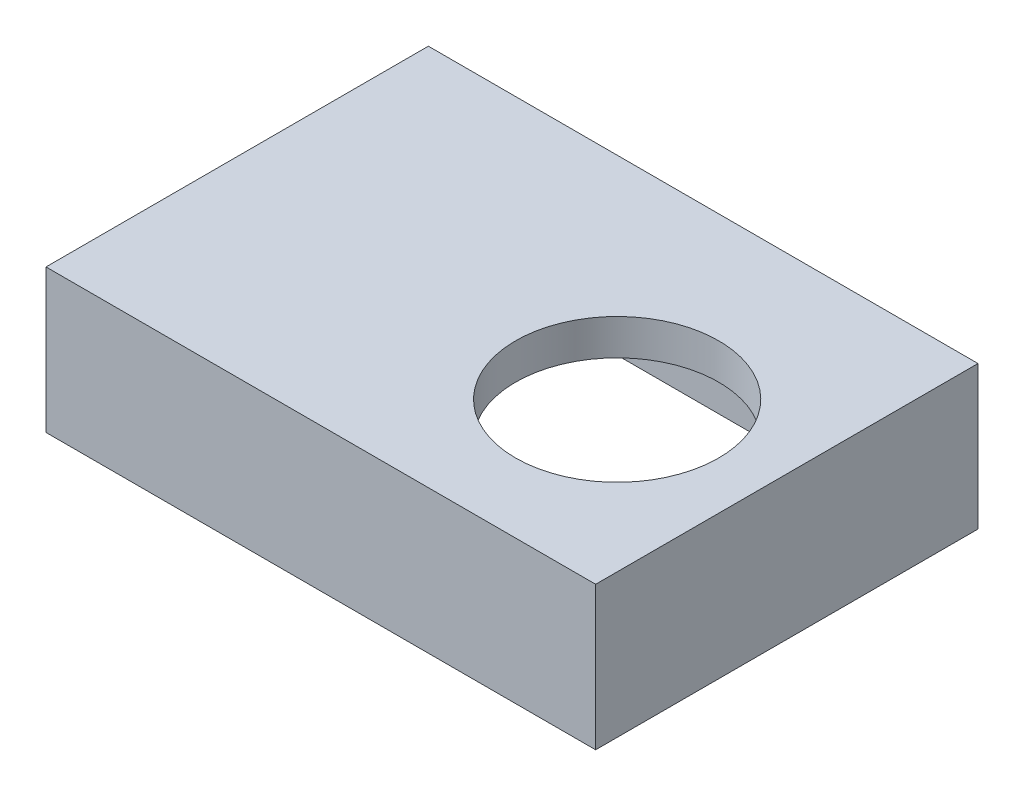
ISO-10303-21;
HEADER;
FILE_DESCRIPTION(('STEP AP214'),'2;1');
FILE_NAME('part.step','',(''),(''),'','','');
FILE_SCHEMA(('AUTOMOTIVE_DESIGN { 1 0 10303 214 1 1 1 1 }'));
ENDSEC;
DATA;
#1=APPLICATION_CONTEXT('core data for automotive mechanical design processes');
#2=APPLICATION_PROTOCOL_DEFINITION('international standard','automotive_design',2000,#1);
#3=PRODUCT_CONTEXT('',#1,'mechanical');
#4=PRODUCT('Part','Part','',(#3));
#5=PRODUCT_RELATED_PRODUCT_CATEGORY('part','',(#4));
#6=PRODUCT_DEFINITION_FORMATION('','',#4);
#7=PRODUCT_DEFINITION_CONTEXT('part definition',#1,'design');
#8=PRODUCT_DEFINITION('design','',#6,#7);
#9=PRODUCT_DEFINITION_SHAPE('','',#8);
#10=(LENGTH_UNIT() NAMED_UNIT(*) SI_UNIT(.MILLI.,.METRE.));
#11=(NAMED_UNIT(*) PLANE_ANGLE_UNIT() SI_UNIT($,.RADIAN.));
#12=(NAMED_UNIT(*) SI_UNIT($,.STERADIAN.) SOLID_ANGLE_UNIT());
#13=UNCERTAINTY_MEASURE_WITH_UNIT(LENGTH_MEASURE(1.E-05),#10,'distance_accuracy_value','');
#14=(GEOMETRIC_REPRESENTATION_CONTEXT(3) GLOBAL_UNCERTAINTY_ASSIGNED_CONTEXT((#13)) GLOBAL_UNIT_ASSIGNED_CONTEXT((#10,
#11,#12)) REPRESENTATION_CONTEXT('',''));
#15=CARTESIAN_POINT('',(0.,0.,0.));
#16=DIRECTION('',(0.,0.,1.));
#17=DIRECTION('',(1.,0.,0.));
#18=AXIS2_PLACEMENT_3D('',#15,#16,#17);
#19=CARTESIAN_POINT('',(0.,0.,0.));
#20=DIRECTION('',(0.,-1.,0.));
#21=DIRECTION('',(0.,0.,-1.));
#22=AXIS2_PLACEMENT_3D('',#19,#20,#21);
#23=PLANE('',#22);
#24=CARTESIAN_POINT('',(10.5,0.,1.7));
#25=DIRECTION('',(0.,1.,0.));
#26=DIRECTION('',(0.,0.,1.));
#27=AXIS2_PLACEMENT_3D('',#24,#25,#26);
#28=CIRCLE('',#27,8.5);
#29=CARTESIAN_POINT('',(10.5,0.,10.2));
#30=VERTEX_POINT('',#29);
#31=EDGE_CURVE('E270',#30,#30,#28,.T.);
#32=ORIENTED_EDGE('',*,*,#31,.T.);
#33=EDGE_LOOP('',(#32));
#34=FACE_BOUND('',#33,.T.);
#35=DIRECTION('',(-1.,0.,0.));
#36=VECTOR('',#35,1.);
#37=CARTESIAN_POINT('',(0.,0.,-13.5));
#38=LINE('',#37,#36);
#39=CARTESIAN_POINT('',(16.5,0.,-13.5));
#40=VERTEX_POINT('',#39);
#41=CARTESIAN_POINT('',(-20.5,0.,-13.5));
#42=VERTEX_POINT('',#41);
#43=EDGE_CURVE('E212',#40,#42,#38,.T.);
#44=ORIENTED_EDGE('',*,*,#43,.F.);
#45=DIRECTION('',(-0.447213595499958,0.,-0.894427190999916));
#46=VECTOR('',#45,1.);
#47=CARTESIAN_POINT('',(20.5,0.,-5.5));
#48=LINE('',#47,#46);
#49=CARTESIAN_POINT('',(20.5,0.,-5.5));
#50=VERTEX_POINT('',#49);
#51=EDGE_CURVE('E178',#50,#40,#48,.T.);
#52=ORIENTED_EDGE('',*,*,#51,.F.);
#53=DIRECTION('',(0.,0.,-1.));
#54=VECTOR('',#53,1.);
#55=CARTESIAN_POINT('',(20.5,0.,0.));
#56=LINE('',#55,#54);
#57=CARTESIAN_POINT('',(20.5,0.,9.49999999999999));
#58=VERTEX_POINT('',#57);
#59=EDGE_CURVE('E237',#58,#50,#56,.T.);
#60=ORIENTED_EDGE('',*,*,#59,.F.);
#61=DIRECTION('',(0.707106781186548,0.,-0.707106781186547));
#62=VECTOR('',#61,1.);
#63=CARTESIAN_POINT('',(20.5,0.,9.49999999999999));
#64=LINE('',#63,#62);
#65=CARTESIAN_POINT('',(16.5,0.,13.5));
#66=VERTEX_POINT('',#65);
#67=EDGE_CURVE('E193',#66,#58,#64,.T.);
#68=ORIENTED_EDGE('',*,*,#67,.F.);
#69=DIRECTION('',(1.,0.,0.));
#70=VECTOR('',#69,1.);
#71=CARTESIAN_POINT('',(0.,0.,13.5));
#72=LINE('',#71,#70);
#73=CARTESIAN_POINT('',(-20.5,0.,13.5));
#74=VERTEX_POINT('',#73);
#75=EDGE_CURVE('E234',#74,#66,#72,.T.);
#76=ORIENTED_EDGE('',*,*,#75,.F.);
#77=DIRECTION('',(0.,0.,1.));
#78=VECTOR('',#77,1.);
#79=CARTESIAN_POINT('',(-20.5,0.,0.));
#80=LINE('',#79,#78);
#81=EDGE_CURVE('E207',#42,#74,#80,.T.);
#82=ORIENTED_EDGE('',*,*,#81,.F.);
#83=EDGE_LOOP('',(#44,#52,#60,#68,#76,#82));
#84=FACE_BOUND('',#83,.T.);
#85=ADVANCED_FACE('F35',(#34,#84),#23,.T.);
#86=CARTESIAN_POINT('',(20.5,-9.,0.));
#87=DIRECTION('',(1.,0.,0.));
#88=DIRECTION('',(0.,0.,-1.));
#89=AXIS2_PLACEMENT_3D('',#86,#87,#88);
#90=PLANE('',#89);
#91=DIRECTION('',(0.,1.,0.));
#92=VECTOR('',#91,1.);
#93=CARTESIAN_POINT('',(20.5,-6.6,-5.5));
#94=LINE('',#93,#92);
#95=CARTESIAN_POINT('',(20.5,-6.6,-5.5));
#96=VERTEX_POINT('',#95);
#97=EDGE_CURVE('E57',#96,#50,#94,.T.);
#98=ORIENTED_EDGE('',*,*,#97,.F.);
#99=DIRECTION('',(0.,0.,1.));
#100=VECTOR('',#99,1.);
#101=CARTESIAN_POINT('',(20.5,-6.6,-13.5));
#102=LINE('',#101,#100);
#103=CARTESIAN_POINT('',(20.5,-6.6,-13.5));
#104=VERTEX_POINT('',#103);
#105=EDGE_CURVE('E179',#104,#96,#102,.T.);
#106=ORIENTED_EDGE('',*,*,#105,.F.);
#107=DIRECTION('',(0.,1.,0.));
#108=VECTOR('',#107,1.);
#109=CARTESIAN_POINT('',(20.5,-9.,-13.5));
#110=LINE('',#109,#108);
#111=CARTESIAN_POINT('',(20.5,-9.,-13.5));
#112=VERTEX_POINT('',#111);
#113=EDGE_CURVE('E242',#112,#104,#110,.T.);
#114=ORIENTED_EDGE('',*,*,#113,.F.);
#115=DIRECTION('',(0.,0.,-1.));
#116=VECTOR('',#115,1.);
#117=CARTESIAN_POINT('',(20.5,-9.,0.));
#118=LINE('',#117,#116);
#119=CARTESIAN_POINT('',(20.5,-9.,13.5));
#120=VERTEX_POINT('',#119);
#121=EDGE_CURVE('E227',#120,#112,#118,.T.);
#122=ORIENTED_EDGE('',*,*,#121,.F.);
#123=DIRECTION('',(0.,1.,0.));
#124=VECTOR('',#123,1.);
#125=CARTESIAN_POINT('',(20.5,-9.,13.5));
#126=LINE('',#125,#124);
#127=CARTESIAN_POINT('',(20.5,-6.6,13.5));
#128=VERTEX_POINT('',#127);
#129=EDGE_CURVE('E244',#120,#128,#126,.T.);
#130=ORIENTED_EDGE('',*,*,#129,.T.);
#131=DIRECTION('',(0.,0.,1.));
#132=VECTOR('',#131,1.);
#133=CARTESIAN_POINT('',(20.5,-6.6,13.5));
#134=LINE('',#133,#132);
#135=CARTESIAN_POINT('',(20.5,-6.6,9.49999999999999));
#136=VERTEX_POINT('',#135);
#137=EDGE_CURVE('E194',#136,#128,#134,.T.);
#138=ORIENTED_EDGE('',*,*,#137,.F.);
#139=DIRECTION('',(0.,1.,0.));
#140=VECTOR('',#139,1.);
#141=CARTESIAN_POINT('',(20.5,-6.6,9.49999999999999));
#142=LINE('',#141,#140);
#143=EDGE_CURVE('E201',#136,#58,#142,.T.);
#144=ORIENTED_EDGE('',*,*,#143,.T.);
#145=ORIENTED_EDGE('',*,*,#59,.T.);
#146=EDGE_LOOP('',(#98,#106,#114,#122,#130,#138,#144,#145));
#147=FACE_BOUND('',#146,.T.);
#148=ADVANCED_FACE('F330',(#147),#90,.F.);
#149=CARTESIAN_POINT('',(0.,-9.,-13.5));
#150=DIRECTION('',(0.,0.,-1.));
#151=DIRECTION('',(-1.,0.,0.));
#152=AXIS2_PLACEMENT_3D('',#149,#150,#151);
#153=PLANE('',#152);
#154=DIRECTION('',(0.,1.,0.));
#155=VECTOR('',#154,1.);
#156=CARTESIAN_POINT('',(16.5,-6.6,-13.5));
#157=LINE('',#156,#155);
#158=CARTESIAN_POINT('',(16.5,-6.6,-13.5));
#159=VERTEX_POINT('',#158);
#160=EDGE_CURVE('E188',#159,#40,#157,.T.);
#161=ORIENTED_EDGE('',*,*,#160,.T.);
#162=ORIENTED_EDGE('',*,*,#43,.T.);
#163=DIRECTION('',(0.,1.,0.));
#164=VECTOR('',#163,1.);
#165=CARTESIAN_POINT('',(-20.5,-9.,-13.5));
#166=LINE('',#165,#164);
#167=CARTESIAN_POINT('',(-20.5,-9.,-13.5));
#168=VERTEX_POINT('',#167);
#169=EDGE_CURVE('E231',#168,#42,#166,.T.);
#170=ORIENTED_EDGE('',*,*,#169,.F.);
#171=DIRECTION('',(-1.,0.,0.));
#172=VECTOR('',#171,1.);
#173=CARTESIAN_POINT('',(0.,-9.,-13.5));
#174=LINE('',#173,#172);
#175=EDGE_CURVE('E229',#112,#168,#174,.T.);
#176=ORIENTED_EDGE('',*,*,#175,.F.);
#177=ORIENTED_EDGE('',*,*,#113,.T.);
#178=DIRECTION('',(1.,0.,0.));
#179=VECTOR('',#178,1.);
#180=CARTESIAN_POINT('',(16.5,-6.6,-13.5));
#181=LINE('',#180,#179);
#182=EDGE_CURVE('E185',#159,#104,#181,.T.);
#183=ORIENTED_EDGE('',*,*,#182,.F.);
#184=EDGE_LOOP('',(#161,#162,#170,#176,#177,#183));
#185=FACE_BOUND('',#184,.T.);
#186=ADVANCED_FACE('F288',(#185),#153,.F.);
#187=CARTESIAN_POINT('',(0.,-9.,13.5));
#188=DIRECTION('',(0.,0.,1.));
#189=DIRECTION('',(1.,0.,0.));
#190=AXIS2_PLACEMENT_3D('',#187,#188,#189);
#191=PLANE('',#190);
#192=DIRECTION('',(0.,1.,0.));
#193=VECTOR('',#192,1.);
#194=CARTESIAN_POINT('',(16.5,-6.6,13.5));
#195=LINE('',#194,#193);
#196=CARTESIAN_POINT('',(16.5,-6.6,13.5));
#197=VERTEX_POINT('',#196);
#198=EDGE_CURVE('E205',#197,#66,#195,.T.);
#199=ORIENTED_EDGE('',*,*,#198,.F.);
#200=DIRECTION('',(-1.,0.,0.));
#201=VECTOR('',#200,1.);
#202=CARTESIAN_POINT('',(16.5,-6.6,13.5));
#203=LINE('',#202,#201);
#204=EDGE_CURVE('E196',#128,#197,#203,.T.);
#205=ORIENTED_EDGE('',*,*,#204,.F.);
#206=ORIENTED_EDGE('',*,*,#129,.F.);
#207=DIRECTION('',(1.,0.,0.));
#208=VECTOR('',#207,1.);
#209=CARTESIAN_POINT('',(0.,-9.,13.5));
#210=LINE('',#209,#208);
#211=CARTESIAN_POINT('',(-20.5,-9.,13.5));
#212=VERTEX_POINT('',#211);
#213=EDGE_CURVE('E225',#212,#120,#210,.T.);
#214=ORIENTED_EDGE('',*,*,#213,.F.);
#215=DIRECTION('',(0.,1.,0.));
#216=VECTOR('',#215,1.);
#217=CARTESIAN_POINT('',(-20.5,-9.,13.5));
#218=LINE('',#217,#216);
#219=EDGE_CURVE('E247',#212,#74,#218,.T.);
#220=ORIENTED_EDGE('',*,*,#219,.T.);
#221=ORIENTED_EDGE('',*,*,#75,.T.);
#222=EDGE_LOOP('',(#199,#205,#206,#214,#220,#221));
#223=FACE_BOUND('',#222,.T.);
#224=ADVANCED_FACE('F298',(#223),#191,.F.);
#225=CARTESIAN_POINT('',(0.,3.,0.));
#226=DIRECTION('',(0.,-1.,0.));
#227=DIRECTION('',(0.,0.,-1.));
#228=AXIS2_PLACEMENT_3D('',#225,#226,#227);
#229=PLANE('',#228);
#230=CARTESIAN_POINT('',(10.5,3.,1.7));
#231=DIRECTION('',(0.,1.,0.));
#232=DIRECTION('',(0.,0.,1.));
#233=AXIS2_PLACEMENT_3D('',#230,#231,#232);
#234=CIRCLE('',#233,8.5);
#235=CARTESIAN_POINT('',(10.5,3.,10.2));
#236=VERTEX_POINT('',#235);
#237=EDGE_CURVE('E269',#236,#236,#234,.T.);
#238=ORIENTED_EDGE('',*,*,#237,.F.);
#239=EDGE_LOOP('',(#238));
#240=FACE_BOUND('',#239,.T.);
#241=DIRECTION('',(0.,0.,-1.));
#242=VECTOR('',#241,1.);
#243=CARTESIAN_POINT('',(-23.,3.,13.));
#244=LINE('',#243,#242);
#245=CARTESIAN_POINT('',(-23.,3.,16.));
#246=VERTEX_POINT('',#245);
#247=CARTESIAN_POINT('',(-23.,3.,-16.));
#248=VERTEX_POINT('',#247);
#249=EDGE_CURVE('E265',#246,#248,#244,.T.);
#250=ORIENTED_EDGE('',*,*,#249,.F.);
#251=DIRECTION('',(-1.,0.,0.));
#252=VECTOR('',#251,1.);
#253=CARTESIAN_POINT('',(23.,3.,16.));
#254=LINE('',#253,#252);
#255=CARTESIAN_POINT('',(23.,3.,16.));
#256=VERTEX_POINT('',#255);
#257=EDGE_CURVE('E260',#256,#246,#254,.T.);
#258=ORIENTED_EDGE('',*,*,#257,.F.);
#259=DIRECTION('',(0.,0.,1.));
#260=VECTOR('',#259,1.);
#261=CARTESIAN_POINT('',(23.,3.,-13.));
#262=LINE('',#261,#260);
#263=CARTESIAN_POINT('',(23.,3.,-16.));
#264=VERTEX_POINT('',#263);
#265=EDGE_CURVE('E267',#264,#256,#262,.T.);
#266=ORIENTED_EDGE('',*,*,#265,.F.);
#267=DIRECTION('',(1.,0.,0.));
#268=VECTOR('',#267,1.);
#269=CARTESIAN_POINT('',(-23.,3.,-16.));
#270=LINE('',#269,#268);
#271=EDGE_CURVE('E252',#248,#264,#270,.T.);
#272=ORIENTED_EDGE('',*,*,#271,.F.);
#273=EDGE_LOOP('',(#250,#258,#266,#272));
#274=FACE_BOUND('',#273,.T.);
#275=ADVANCED_FACE('F310',(#240,#274),#229,.F.);
#276=CARTESIAN_POINT('',(10.5,0.,1.7));
#277=DIRECTION('',(0.,1.,0.));
#278=DIRECTION('',(0.,0.,1.));
#279=AXIS2_PLACEMENT_3D('',#276,#277,#278);
#280=CYLINDRICAL_SURFACE('',#279,8.5);
#281=ORIENTED_EDGE('',*,*,#31,.F.);
#282=EDGE_LOOP('',(#281));
#283=FACE_BOUND('',#282,.T.);
#284=ORIENTED_EDGE('',*,*,#237,.T.);
#285=EDGE_LOOP('',(#284));
#286=FACE_BOUND('',#285,.T.);
#287=ADVANCED_FACE('F319',(#283,#286),#280,.F.);
#288=CARTESIAN_POINT('',(23.,0.,0.));
#289=DIRECTION('',(1.,0.,0.));
#290=DIRECTION('',(0.,0.,-1.));
#291=AXIS2_PLACEMENT_3D('',#288,#289,#290);
#292=PLANE('',#291);
#293=DIRECTION('',(0.,1.,0.));
#294=VECTOR('',#293,1.);
#295=CARTESIAN_POINT('',(23.,0.,16.));
#296=LINE('',#295,#294);
#297=CARTESIAN_POINT('',(23.,-9.,16.));
#298=VERTEX_POINT('',#297);
#299=EDGE_CURVE('E257',#298,#256,#296,.T.);
#300=ORIENTED_EDGE('',*,*,#299,.F.);
#301=DIRECTION('',(0.,0.,1.));
#302=VECTOR('',#301,1.);
#303=CARTESIAN_POINT('',(23.,-9.,0.));
#304=LINE('',#303,#302);
#305=CARTESIAN_POINT('',(23.,-9.,-16.));
#306=VERTEX_POINT('',#305);
#307=EDGE_CURVE('E218',#306,#298,#304,.T.);
#308=ORIENTED_EDGE('',*,*,#307,.F.);
#309=DIRECTION('',(0.,-1.,0.));
#310=VECTOR('',#309,1.);
#311=CARTESIAN_POINT('',(23.,0.,-16.));
#312=LINE('',#311,#310);
#313=EDGE_CURVE('E255',#264,#306,#312,.T.);
#314=ORIENTED_EDGE('',*,*,#313,.F.);
#315=ORIENTED_EDGE('',*,*,#265,.T.);
#316=EDGE_LOOP('',(#300,#308,#314,#315));
#317=FACE_BOUND('',#316,.T.);
#318=ADVANCED_FACE('F317',(#317),#292,.T.);
#319=CARTESIAN_POINT('',(-23.,0.,0.));
#320=DIRECTION('',(-1.,0.,0.));
#321=DIRECTION('',(0.,0.,1.));
#322=AXIS2_PLACEMENT_3D('',#319,#320,#321);
#323=PLANE('',#322);
#324=DIRECTION('',(0.,1.,0.));
#325=VECTOR('',#324,1.);
#326=CARTESIAN_POINT('',(-23.,-9.,8.29188748329912));
#327=LINE('',#326,#325);
#328=CARTESIAN_POINT('',(-23.,-9.,8.29188748329912));
#329=VERTEX_POINT('',#328);
#330=CARTESIAN_POINT('',(-23.,-3.,8.29188748329912));
#331=VERTEX_POINT('',#330);
#332=EDGE_CURVE('E160',#329,#331,#327,.T.);
#333=ORIENTED_EDGE('',*,*,#332,.F.);
#334=DIRECTION('',(0.,0.,-1.));
#335=VECTOR('',#334,1.);
#336=CARTESIAN_POINT('',(-23.,-9.,0.));
#337=LINE('',#336,#335);
#338=CARTESIAN_POINT('',(-23.,-9.,16.));
#339=VERTEX_POINT('',#338);
#340=EDGE_CURVE('E213',#339,#329,#337,.T.);
#341=ORIENTED_EDGE('',*,*,#340,.F.);
#342=DIRECTION('',(0.,-1.,0.));
#343=VECTOR('',#342,1.);
#344=CARTESIAN_POINT('',(-23.,0.,16.));
#345=LINE('',#344,#343);
#346=EDGE_CURVE('E263',#246,#339,#345,.T.);
#347=ORIENTED_EDGE('',*,*,#346,.F.);
#348=ORIENTED_EDGE('',*,*,#249,.T.);
#349=DIRECTION('',(0.,1.,0.));
#350=VECTOR('',#349,1.);
#351=CARTESIAN_POINT('',(-23.,0.,-16.));
#352=LINE('',#351,#350);
#353=CARTESIAN_POINT('',(-23.,-9.,-16.));
#354=VERTEX_POINT('',#353);
#355=EDGE_CURVE('E249',#354,#248,#352,.T.);
#356=ORIENTED_EDGE('',*,*,#355,.F.);
#357=CARTESIAN_POINT('',(-23.,-9.,-9.30925385289516));
#358=VERTEX_POINT('',#357);
#359=EDGE_CURVE('E211',#358,#354,#337,.T.);
#360=ORIENTED_EDGE('',*,*,#359,.F.);
#361=DIRECTION('',(0.,-1.,0.));
#362=VECTOR('',#361,1.);
#363=CARTESIAN_POINT('',(-23.,-9.,-9.30925385289516));
#364=LINE('',#363,#362);
#365=CARTESIAN_POINT('',(-23.,-3.,-9.30925385289516));
#366=VERTEX_POINT('',#365);
#367=EDGE_CURVE('E49',#366,#358,#364,.T.);
#368=ORIENTED_EDGE('',*,*,#367,.F.);
#369=DIRECTION('',(0.,0.,-1.));
#370=VECTOR('',#369,1.);
#371=CARTESIAN_POINT('',(-23.,-3.,8.29188748329912));
#372=LINE('',#371,#370);
#373=EDGE_CURVE('E154',#331,#366,#372,.T.);
#374=ORIENTED_EDGE('',*,*,#373,.F.);
#375=EDGE_LOOP('',(#333,#341,#347,#348,#356,#360,#368,#374));
#376=FACE_BOUND('',#375,.T.);
#377=ADVANCED_FACE('F167',(#376),#323,.T.);
#378=CARTESIAN_POINT('',(0.,0.,16.));
#379=DIRECTION('',(0.,0.,1.));
#380=DIRECTION('',(1.,0.,0.));
#381=AXIS2_PLACEMENT_3D('',#378,#379,#380);
#382=PLANE('',#381);
#383=ORIENTED_EDGE('',*,*,#299,.T.);
#384=ORIENTED_EDGE('',*,*,#257,.T.);
#385=ORIENTED_EDGE('',*,*,#346,.T.);
#386=DIRECTION('',(-1.,0.,0.));
#387=VECTOR('',#386,1.);
#388=CARTESIAN_POINT('',(0.,-9.,16.));
#389=LINE('',#388,#387);
#390=EDGE_CURVE('E208',#298,#339,#389,.T.);
#391=ORIENTED_EDGE('',*,*,#390,.F.);
#392=EDGE_LOOP('',(#383,#384,#385,#391));
#393=FACE_BOUND('',#392,.T.);
#394=ADVANCED_FACE('F307',(#393),#382,.T.);
#395=CARTESIAN_POINT('',(0.,0.,-16.));
#396=DIRECTION('',(0.,0.,-1.));
#397=DIRECTION('',(-1.,0.,0.));
#398=AXIS2_PLACEMENT_3D('',#395,#396,#397);
#399=PLANE('',#398);
#400=ORIENTED_EDGE('',*,*,#355,.T.);
#401=ORIENTED_EDGE('',*,*,#271,.T.);
#402=ORIENTED_EDGE('',*,*,#313,.T.);
#403=DIRECTION('',(1.,0.,0.));
#404=VECTOR('',#403,1.);
#405=CARTESIAN_POINT('',(0.,-9.,-16.));
#406=LINE('',#405,#404);
#407=EDGE_CURVE('E215',#354,#306,#406,.T.);
#408=ORIENTED_EDGE('',*,*,#407,.F.);
#409=EDGE_LOOP('',(#400,#401,#402,#408));
#410=FACE_BOUND('',#409,.T.);
#411=ADVANCED_FACE('F314',(#410),#399,.T.);
#412=CARTESIAN_POINT('',(-20.5,-9.,0.));
#413=DIRECTION('',(-1.,0.,0.));
#414=DIRECTION('',(0.,0.,1.));
#415=AXIS2_PLACEMENT_3D('',#412,#413,#414);
#416=PLANE('',#415);
#417=DIRECTION('',(0.,0.,1.));
#418=VECTOR('',#417,1.);
#419=CARTESIAN_POINT('',(-20.5,-9.,0.));
#420=LINE('',#419,#418);
#421=CARTESIAN_POINT('',(-20.5,-9.,8.29188748329912));
#422=VERTEX_POINT('',#421);
#423=EDGE_CURVE('E221',#422,#212,#420,.T.);
#424=ORIENTED_EDGE('',*,*,#423,.F.);
#425=DIRECTION('',(0.,1.,0.));
#426=VECTOR('',#425,1.);
#427=CARTESIAN_POINT('',(-20.5,-9.,8.29188748329912));
#428=LINE('',#427,#426);
#429=CARTESIAN_POINT('',(-20.5,-3.,8.29188748329912));
#430=VERTEX_POINT('',#429);
#431=EDGE_CURVE('E176',#422,#430,#428,.T.);
#432=ORIENTED_EDGE('',*,*,#431,.T.);
#433=DIRECTION('',(0.,0.,-1.));
#434=VECTOR('',#433,1.);
#435=CARTESIAN_POINT('',(-20.5,-3.,0.));
#436=LINE('',#435,#434);
#437=CARTESIAN_POINT('',(-20.5,-3.,-9.30925385289516));
#438=VERTEX_POINT('',#437);
#439=EDGE_CURVE('E11',#430,#438,#436,.T.);
#440=ORIENTED_EDGE('',*,*,#439,.T.);
#441=DIRECTION('',(0.,-1.,0.));
#442=VECTOR('',#441,1.);
#443=CARTESIAN_POINT('',(-20.5,-9.,-9.30925385289516));
#444=LINE('',#443,#442);
#445=CARTESIAN_POINT('',(-20.5,-9.,-9.30925385289516));
#446=VERTEX_POINT('',#445);
#447=EDGE_CURVE('E172',#438,#446,#444,.T.);
#448=ORIENTED_EDGE('',*,*,#447,.T.);
#449=EDGE_CURVE('E222',#168,#446,#420,.T.);
#450=ORIENTED_EDGE('',*,*,#449,.F.);
#451=ORIENTED_EDGE('',*,*,#169,.T.);
#452=ORIENTED_EDGE('',*,*,#81,.T.);
#453=ORIENTED_EDGE('',*,*,#219,.F.);
#454=EDGE_LOOP('',(#424,#432,#440,#448,#450,#451,#452,#453));
#455=FACE_BOUND('',#454,.T.);
#456=ADVANCED_FACE('F281',(#455),#416,.F.);
#457=CARTESIAN_POINT('',(0.,-9.,0.));
#458=DIRECTION('',(0.,-1.,0.));
#459=DIRECTION('',(0.,0.,-1.));
#460=AXIS2_PLACEMENT_3D('',#457,#458,#459);
#461=PLANE('',#460);
#462=DIRECTION('',(-1.,0.,0.));
#463=VECTOR('',#462,1.);
#464=CARTESIAN_POINT('',(0.,-9.,8.29188748329912));
#465=LINE('',#464,#463);
#466=EDGE_CURVE('E42',#422,#329,#465,.T.);
#467=ORIENTED_EDGE('',*,*,#466,.F.);
#468=ORIENTED_EDGE('',*,*,#423,.T.);
#469=ORIENTED_EDGE('',*,*,#213,.T.);
#470=ORIENTED_EDGE('',*,*,#121,.T.);
#471=ORIENTED_EDGE('',*,*,#175,.T.);
#472=ORIENTED_EDGE('',*,*,#449,.T.);
#473=DIRECTION('',(1.,0.,0.));
#474=VECTOR('',#473,1.);
#475=CARTESIAN_POINT('',(0.,-9.,-9.30925385289516));
#476=LINE('',#475,#474);
#477=EDGE_CURVE('E273',#358,#446,#476,.T.);
#478=ORIENTED_EDGE('',*,*,#477,.F.);
#479=ORIENTED_EDGE('',*,*,#359,.T.);
#480=ORIENTED_EDGE('',*,*,#407,.T.);
#481=ORIENTED_EDGE('',*,*,#307,.T.);
#482=ORIENTED_EDGE('',*,*,#390,.T.);
#483=ORIENTED_EDGE('',*,*,#340,.T.);
#484=EDGE_LOOP('',(#467,#468,#469,#470,#471,#472,#478,#479,#480,#481,#482,#483));
#485=FACE_BOUND('',#484,.T.);
#486=ADVANCED_FACE('F282',(#485),#461,.T.);
#487=CARTESIAN_POINT('',(20.5,-6.6,9.49999999999999));
#488=DIRECTION('',(0.707106781186547,0.,0.707106781186548));
#489=DIRECTION('',(0.707106781186548,0.,-0.707106781186547));
#490=AXIS2_PLACEMENT_3D('',#487,#488,#489);
#491=PLANE('',#490);
#492=ORIENTED_EDGE('',*,*,#67,.T.);
#493=ORIENTED_EDGE('',*,*,#143,.F.);
#494=DIRECTION('',(0.707106781186548,0.,-0.707106781186547));
#495=VECTOR('',#494,1.);
#496=CARTESIAN_POINT('',(20.5,-6.6,9.49999999999999));
#497=LINE('',#496,#495);
#498=EDGE_CURVE('E198',#197,#136,#497,.T.);
#499=ORIENTED_EDGE('',*,*,#498,.F.);
#500=ORIENTED_EDGE('',*,*,#198,.T.);
#501=EDGE_LOOP('',(#492,#493,#499,#500));
#502=FACE_BOUND('',#501,.T.);
#503=ADVANCED_FACE('F372',(#502),#491,.F.);
#504=CARTESIAN_POINT('',(0.,-6.6,0.));
#505=DIRECTION('',(0.,-1.,0.));
#506=DIRECTION('',(0.,0.,-1.));
#507=AXIS2_PLACEMENT_3D('',#504,#505,#506);
#508=PLANE('',#507);
#509=ORIENTED_EDGE('',*,*,#137,.T.);
#510=ORIENTED_EDGE('',*,*,#204,.T.);
#511=ORIENTED_EDGE('',*,*,#498,.T.);
#512=EDGE_LOOP('',(#509,#510,#511));
#513=FACE_BOUND('',#512,.T.);
#514=ADVANCED_FACE('F380',(#513),#508,.T.);
#515=CARTESIAN_POINT('',(20.5,-6.6,-5.5));
#516=DIRECTION('',(0.894427190999916,0.,-0.447213595499958));
#517=DIRECTION('',(-0.447213595499958,0.,-0.894427190999916));
#518=AXIS2_PLACEMENT_3D('',#515,#516,#517);
#519=PLANE('',#518);
#520=ORIENTED_EDGE('',*,*,#51,.T.);
#521=ORIENTED_EDGE('',*,*,#160,.F.);
#522=DIRECTION('',(-0.447213595499958,0.,-0.894427190999916));
#523=VECTOR('',#522,1.);
#524=CARTESIAN_POINT('',(20.5,-6.6,-5.5));
#525=LINE('',#524,#523);
#526=EDGE_CURVE('E182',#96,#159,#525,.T.);
#527=ORIENTED_EDGE('',*,*,#526,.F.);
#528=ORIENTED_EDGE('',*,*,#97,.T.);
#529=EDGE_LOOP('',(#520,#521,#527,#528));
#530=FACE_BOUND('',#529,.T.);
#531=ADVANCED_FACE('F388',(#530),#519,.F.);
#532=CARTESIAN_POINT('',(0.,-6.6,0.));
#533=DIRECTION('',(0.,1.,0.));
#534=DIRECTION('',(0.,0.,1.));
#535=AXIS2_PLACEMENT_3D('',#532,#533,#534);
#536=PLANE('',#535);
#537=ORIENTED_EDGE('',*,*,#105,.T.);
#538=ORIENTED_EDGE('',*,*,#526,.T.);
#539=ORIENTED_EDGE('',*,*,#182,.T.);
#540=EDGE_LOOP('',(#537,#538,#539));
#541=FACE_BOUND('',#540,.T.);
#542=ADVANCED_FACE('F396',(#541),#536,.F.);
#543=CARTESIAN_POINT('',(-16.4,-3.,8.29188748329912));
#544=DIRECTION('',(0.,1.,0.));
#545=DIRECTION('',(0.,0.,1.));
#546=AXIS2_PLACEMENT_3D('',#543,#544,#545);
#547=PLANE('',#546);
#548=DIRECTION('',(-1.,0.,0.));
#549=VECTOR('',#548,1.);
#550=CARTESIAN_POINT('',(-16.4,-3.,8.29188748329912));
#551=LINE('',#550,#549);
#552=EDGE_CURVE('E149',#430,#331,#551,.T.);
#553=ORIENTED_EDGE('',*,*,#552,.T.);
#554=ORIENTED_EDGE('',*,*,#373,.T.);
#555=DIRECTION('',(-1.,0.,0.));
#556=VECTOR('',#555,1.);
#557=CARTESIAN_POINT('',(-16.4,-3.,-9.30925385289516));
#558=LINE('',#557,#556);
#559=EDGE_CURVE('E157',#438,#366,#558,.T.);
#560=ORIENTED_EDGE('',*,*,#559,.F.);
#561=ORIENTED_EDGE('',*,*,#439,.F.);
#562=EDGE_LOOP('',(#553,#554,#560,#561));
#563=FACE_BOUND('',#562,.T.);
#564=ADVANCED_FACE('F151',(#563),#547,.F.);
#565=CARTESIAN_POINT('',(-16.4,-9.,8.29188748329912));
#566=DIRECTION('',(0.,0.,1.));
#567=DIRECTION('',(1.,0.,0.));
#568=AXIS2_PLACEMENT_3D('',#565,#566,#567);
#569=PLANE('',#568);
#570=ORIENTED_EDGE('',*,*,#466,.T.);
#571=ORIENTED_EDGE('',*,*,#332,.T.);
#572=ORIENTED_EDGE('',*,*,#552,.F.);
#573=ORIENTED_EDGE('',*,*,#431,.F.);
#574=EDGE_LOOP('',(#570,#571,#572,#573));
#575=FACE_BOUND('',#574,.T.);
#576=ADVANCED_FACE('F161',(#575),#569,.F.);
#577=CARTESIAN_POINT('',(-16.4,-9.,-9.30925385289516));
#578=DIRECTION('',(0.,0.,-1.));
#579=DIRECTION('',(-1.,0.,0.));
#580=AXIS2_PLACEMENT_3D('',#577,#578,#579);
#581=PLANE('',#580);
#582=ORIENTED_EDGE('',*,*,#559,.T.);
#583=ORIENTED_EDGE('',*,*,#367,.T.);
#584=ORIENTED_EDGE('',*,*,#477,.T.);
#585=ORIENTED_EDGE('',*,*,#447,.F.);
#586=EDGE_LOOP('',(#582,#583,#584,#585));
#587=FACE_BOUND('',#586,.T.);
#588=ADVANCED_FACE('F276',(#587),#581,.F.);
#589=CLOSED_SHELL('',(#85,#148,#186,#224,#275,#287,#318,#377,#394,#411,#456,#486,#503,#514,#531,
#542,#564,#576,#588));
#590=MANIFOLD_SOLID_BREP('B2',#589);
#591=ADVANCED_BREP_SHAPE_REPRESENTATION('',(#18,#590),#14);
#592=SHAPE_DEFINITION_REPRESENTATION(#9,#591);
ENDSEC;
END-ISO-10303-21;
